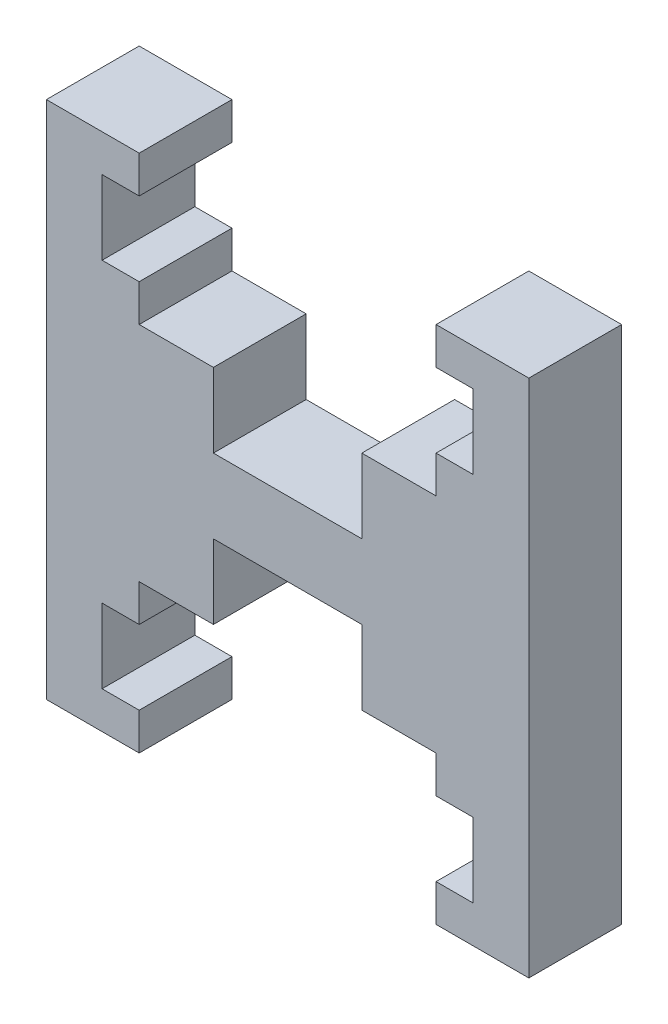
ISO-10303-21;
HEADER;
FILE_DESCRIPTION(('STEP AP214'),'2;1');
FILE_NAME('part.step','',(''),(''),'','','');
FILE_SCHEMA(('AUTOMOTIVE_DESIGN { 1 0 10303 214 1 1 1 1 }'));
ENDSEC;
DATA;
#1=APPLICATION_CONTEXT('core data for automotive mechanical design processes');
#2=APPLICATION_PROTOCOL_DEFINITION('international standard','automotive_design',2000,#1);
#3=PRODUCT_CONTEXT('',#1,'mechanical');
#4=PRODUCT('Part','Part','',(#3));
#5=PRODUCT_RELATED_PRODUCT_CATEGORY('part','',(#4));
#6=PRODUCT_DEFINITION_FORMATION('','',#4);
#7=PRODUCT_DEFINITION_CONTEXT('part definition',#1,'design');
#8=PRODUCT_DEFINITION('design','',#6,#7);
#9=PRODUCT_DEFINITION_SHAPE('','',#8);
#10=(LENGTH_UNIT() NAMED_UNIT(*) SI_UNIT(.MILLI.,.METRE.));
#11=(NAMED_UNIT(*) PLANE_ANGLE_UNIT() SI_UNIT($,.RADIAN.));
#12=(NAMED_UNIT(*) SI_UNIT($,.STERADIAN.) SOLID_ANGLE_UNIT());
#13=UNCERTAINTY_MEASURE_WITH_UNIT(LENGTH_MEASURE(1.E-05),#10,'distance_accuracy_value','');
#14=(GEOMETRIC_REPRESENTATION_CONTEXT(3) GLOBAL_UNCERTAINTY_ASSIGNED_CONTEXT((#13)) GLOBAL_UNIT_ASSIGNED_CONTEXT((#10,
#11,#12)) REPRESENTATION_CONTEXT('',''));
#15=CARTESIAN_POINT('',(0.,0.,0.));
#16=DIRECTION('',(0.,0.,1.));
#17=DIRECTION('',(1.,0.,0.));
#18=AXIS2_PLACEMENT_3D('',#15,#16,#17);
#19=CARTESIAN_POINT('',(101.6,50.7999999999999,63.5));
#20=DIRECTION('',(1.,0.,0.));
#21=DIRECTION('',(0.,1.,0.));
#22=AXIS2_PLACEMENT_3D('',#19,#20,#21);
#23=PLANE('',#22);
#24=DIRECTION('',(0.,-1.,0.));
#25=VECTOR('',#24,1.);
#26=CARTESIAN_POINT('',(101.6,50.7999999999999,-63.5));
#27=LINE('',#26,#25);
#28=CARTESIAN_POINT('',(101.6,152.4,-63.5));
#29=VERTEX_POINT('',#28);
#30=CARTESIAN_POINT('',(101.6,50.7999999999999,-63.5));
#31=VERTEX_POINT('',#30);
#32=EDGE_CURVE('E312',#29,#31,#27,.T.);
#33=ORIENTED_EDGE('',*,*,#32,.T.);
#34=DIRECTION('',(0.,0.,-1.));
#35=VECTOR('',#34,1.);
#36=CARTESIAN_POINT('',(101.6,50.7999999999999,63.5));
#37=LINE('',#36,#35);
#38=CARTESIAN_POINT('',(101.6,50.7999999999999,63.5));
#39=VERTEX_POINT('',#38);
#40=EDGE_CURVE('E11',#39,#31,#37,.T.);
#41=ORIENTED_EDGE('',*,*,#40,.F.);
#42=DIRECTION('',(0.,-1.,0.));
#43=VECTOR('',#42,1.);
#44=CARTESIAN_POINT('',(101.6,50.7999999999999,63.5));
#45=LINE('',#44,#43);
#46=CARTESIAN_POINT('',(101.6,152.4,63.5));
#47=VERTEX_POINT('',#46);
#48=EDGE_CURVE('E418',#47,#39,#45,.T.);
#49=ORIENTED_EDGE('',*,*,#48,.F.);
#50=DIRECTION('',(0.,0.,-1.));
#51=VECTOR('',#50,1.);
#52=CARTESIAN_POINT('',(101.6,152.4,63.5));
#53=LINE('',#52,#51);
#54=EDGE_CURVE('E308',#47,#29,#53,.T.);
#55=ORIENTED_EDGE('',*,*,#54,.T.);
#56=EDGE_LOOP('',(#33,#41,#49,#55));
#57=FACE_BOUND('',#56,.T.);
#58=ADVANCED_FACE('F43',(#57),#23,.F.);
#59=CARTESIAN_POINT('',(101.6,50.7999999999999,63.5));
#60=DIRECTION('',(0.,-1.,0.));
#61=DIRECTION('',(0.,0.,-1.));
#62=AXIS2_PLACEMENT_3D('',#59,#60,#61);
#63=PLANE('',#62);
#64=DIRECTION('',(-1.,0.,0.));
#65=VECTOR('',#64,1.);
#66=CARTESIAN_POINT('',(101.6,50.7999999999999,-63.5));
#67=LINE('',#66,#65);
#68=CARTESIAN_POINT('',(-101.6,50.7999999999999,-63.5));
#69=VERTEX_POINT('',#68);
#70=EDGE_CURVE('E316',#31,#69,#67,.T.);
#71=ORIENTED_EDGE('',*,*,#70,.T.);
#72=DIRECTION('',(0.,0.,-1.));
#73=VECTOR('',#72,1.);
#74=CARTESIAN_POINT('',(-101.6,50.7999999999999,63.5));
#75=LINE('',#74,#73);
#76=CARTESIAN_POINT('',(-101.6,50.7999999999999,63.5));
#77=VERTEX_POINT('',#76);
#78=EDGE_CURVE('E52',#77,#69,#75,.T.);
#79=ORIENTED_EDGE('',*,*,#78,.F.);
#80=DIRECTION('',(-1.,0.,0.));
#81=VECTOR('',#80,1.);
#82=CARTESIAN_POINT('',(101.6,50.7999999999999,63.5));
#83=LINE('',#82,#81);
#84=EDGE_CURVE('E187',#39,#77,#83,.T.);
#85=ORIENTED_EDGE('',*,*,#84,.F.);
#86=ORIENTED_EDGE('',*,*,#40,.T.);
#87=EDGE_LOOP('',(#71,#79,#85,#86));
#88=FACE_BOUND('',#87,.T.);
#89=ADVANCED_FACE('F680',(#88),#63,.F.);
#90=CARTESIAN_POINT('',(-101.6,50.7999999999999,63.5));
#91=DIRECTION('',(-1.,0.,0.));
#92=DIRECTION('',(0.,-1.,0.));
#93=AXIS2_PLACEMENT_3D('',#90,#91,#92);
#94=PLANE('',#93);
#95=DIRECTION('',(0.,1.,0.));
#96=VECTOR('',#95,1.);
#97=CARTESIAN_POINT('',(-101.6,50.7999999999999,-63.5));
#98=LINE('',#97,#96);
#99=CARTESIAN_POINT('',(-101.6,152.4,-63.5));
#100=VERTEX_POINT('',#99);
#101=EDGE_CURVE('E319',#69,#100,#98,.T.);
#102=ORIENTED_EDGE('',*,*,#101,.T.);
#103=DIRECTION('',(0.,0.,-1.));
#104=VECTOR('',#103,1.);
#105=CARTESIAN_POINT('',(-101.6,152.4,63.5));
#106=LINE('',#105,#104);
#107=CARTESIAN_POINT('',(-101.6,152.4,63.5));
#108=VERTEX_POINT('',#107);
#109=EDGE_CURVE('E541',#108,#100,#106,.T.);
#110=ORIENTED_EDGE('',*,*,#109,.F.);
#111=DIRECTION('',(0.,1.,0.));
#112=VECTOR('',#111,1.);
#113=CARTESIAN_POINT('',(-101.6,50.7999999999999,63.5));
#114=LINE('',#113,#112);
#115=EDGE_CURVE('E551',#77,#108,#114,.T.);
#116=ORIENTED_EDGE('',*,*,#115,.F.);
#117=ORIENTED_EDGE('',*,*,#78,.T.);
#118=EDGE_LOOP('',(#102,#110,#116,#117));
#119=FACE_BOUND('',#118,.T.);
#120=ADVANCED_FACE('F549',(#119),#94,.F.);
#121=CARTESIAN_POINT('',(-101.6,152.4,63.5));
#122=DIRECTION('',(0.,-1.,0.));
#123=DIRECTION('',(0.,0.,-1.));
#124=AXIS2_PLACEMENT_3D('',#121,#122,#123);
#125=PLANE('',#124);
#126=DIRECTION('',(-1.,0.,0.));
#127=VECTOR('',#126,1.);
#128=CARTESIAN_POINT('',(-101.6,152.4,-63.5));
#129=LINE('',#128,#127);
#130=CARTESIAN_POINT('',(-203.2,152.4,-63.5));
#131=VERTEX_POINT('',#130);
#132=EDGE_CURVE('E322',#100,#131,#129,.T.);
#133=ORIENTED_EDGE('',*,*,#132,.T.);
#134=DIRECTION('',(0.,0.,-1.));
#135=VECTOR('',#134,1.);
#136=CARTESIAN_POINT('',(-203.2,152.4,63.5));
#137=LINE('',#136,#135);
#138=CARTESIAN_POINT('',(-203.2,152.4,63.5));
#139=VERTEX_POINT('',#138);
#140=EDGE_CURVE('E537',#139,#131,#137,.T.);
#141=ORIENTED_EDGE('',*,*,#140,.F.);
#142=DIRECTION('',(-1.,0.,0.));
#143=VECTOR('',#142,1.);
#144=CARTESIAN_POINT('',(-101.6,152.4,63.5));
#145=LINE('',#144,#143);
#146=EDGE_CURVE('E570',#108,#139,#145,.T.);
#147=ORIENTED_EDGE('',*,*,#146,.F.);
#148=ORIENTED_EDGE('',*,*,#109,.T.);
#149=EDGE_LOOP('',(#133,#141,#147,#148));
#150=FACE_BOUND('',#149,.T.);
#151=ADVANCED_FACE('F560',(#150),#125,.F.);
#152=CARTESIAN_POINT('',(-203.2,152.4,63.5));
#153=DIRECTION('',(-1.,0.,0.));
#154=DIRECTION('',(0.,-1.,0.));
#155=AXIS2_PLACEMENT_3D('',#152,#153,#154);
#156=PLANE('',#155);
#157=DIRECTION('',(0.,1.,0.));
#158=VECTOR('',#157,1.);
#159=CARTESIAN_POINT('',(-203.2,152.4,-63.5));
#160=LINE('',#159,#158);
#161=CARTESIAN_POINT('',(-203.2,203.2,-63.5));
#162=VERTEX_POINT('',#161);
#163=EDGE_CURVE('E325',#131,#162,#160,.T.);
#164=ORIENTED_EDGE('',*,*,#163,.T.);
#165=DIRECTION('',(0.,0.,-1.));
#166=VECTOR('',#165,1.);
#167=CARTESIAN_POINT('',(-203.2,203.2,63.5));
#168=LINE('',#167,#166);
#169=CARTESIAN_POINT('',(-203.2,203.2,63.5));
#170=VERTEX_POINT('',#169);
#171=EDGE_CURVE('E533',#170,#162,#168,.T.);
#172=ORIENTED_EDGE('',*,*,#171,.F.);
#173=DIRECTION('',(0.,1.,0.));
#174=VECTOR('',#173,1.);
#175=CARTESIAN_POINT('',(-203.2,152.4,63.5));
#176=LINE('',#175,#174);
#177=EDGE_CURVE('E566',#139,#170,#176,.T.);
#178=ORIENTED_EDGE('',*,*,#177,.F.);
#179=ORIENTED_EDGE('',*,*,#140,.T.);
#180=EDGE_LOOP('',(#164,#172,#178,#179));
#181=FACE_BOUND('',#180,.T.);
#182=ADVANCED_FACE('F564',(#181),#156,.F.);
#183=CARTESIAN_POINT('',(-203.2,203.2,63.5));
#184=DIRECTION('',(0.,-1.,0.));
#185=DIRECTION('',(1.,0.,0.));
#186=AXIS2_PLACEMENT_3D('',#183,#184,#185);
#187=PLANE('',#186);
#188=DIRECTION('',(-1.,0.,0.));
#189=VECTOR('',#188,1.);
#190=CARTESIAN_POINT('',(-203.2,203.2,-63.5));
#191=LINE('',#190,#189);
#192=CARTESIAN_POINT('',(-254.,203.2,-63.5));
#193=VERTEX_POINT('',#192);
#194=EDGE_CURVE('E328',#162,#193,#191,.T.);
#195=ORIENTED_EDGE('',*,*,#194,.T.);
#196=DIRECTION('',(0.,0.,-1.));
#197=VECTOR('',#196,1.);
#198=CARTESIAN_POINT('',(-254.,203.2,63.5));
#199=LINE('',#198,#197);
#200=CARTESIAN_POINT('',(-254.,203.2,63.5));
#201=VERTEX_POINT('',#200);
#202=EDGE_CURVE('E529',#201,#193,#199,.T.);
#203=ORIENTED_EDGE('',*,*,#202,.F.);
#204=DIRECTION('',(-1.,0.,0.));
#205=VECTOR('',#204,1.);
#206=CARTESIAN_POINT('',(-203.2,203.2,63.5));
#207=LINE('',#206,#205);
#208=EDGE_CURVE('E569',#170,#201,#207,.T.);
#209=ORIENTED_EDGE('',*,*,#208,.F.);
#210=ORIENTED_EDGE('',*,*,#171,.T.);
#211=EDGE_LOOP('',(#195,#203,#209,#210));
#212=FACE_BOUND('',#211,.T.);
#213=ADVANCED_FACE('F693',(#212),#187,.F.);
#214=CARTESIAN_POINT('',(-254.,203.2,63.5));
#215=DIRECTION('',(-1.,0.,0.));
#216=DIRECTION('',(0.,-1.,0.));
#217=AXIS2_PLACEMENT_3D('',#214,#215,#216);
#218=PLANE('',#217);
#219=DIRECTION('',(0.,1.,0.));
#220=VECTOR('',#219,1.);
#221=CARTESIAN_POINT('',(-254.,203.2,-63.5));
#222=LINE('',#221,#220);
#223=CARTESIAN_POINT('',(-254.,304.8,-63.5));
#224=VERTEX_POINT('',#223);
#225=EDGE_CURVE('E331',#193,#224,#222,.T.);
#226=ORIENTED_EDGE('',*,*,#225,.T.);
#227=DIRECTION('',(0.,0.,-1.));
#228=VECTOR('',#227,1.);
#229=CARTESIAN_POINT('',(-254.,304.8,63.5));
#230=LINE('',#229,#228);
#231=CARTESIAN_POINT('',(-254.,304.8,63.5));
#232=VERTEX_POINT('',#231);
#233=EDGE_CURVE('E525',#232,#224,#230,.T.);
#234=ORIENTED_EDGE('',*,*,#233,.F.);
#235=DIRECTION('',(0.,1.,0.));
#236=VECTOR('',#235,1.);
#237=CARTESIAN_POINT('',(-254.,203.2,63.5));
#238=LINE('',#237,#236);
#239=EDGE_CURVE('E574',#201,#232,#238,.T.);
#240=ORIENTED_EDGE('',*,*,#239,.F.);
#241=ORIENTED_EDGE('',*,*,#202,.T.);
#242=EDGE_LOOP('',(#226,#234,#240,#241));
#243=FACE_BOUND('',#242,.T.);
#244=ADVANCED_FACE('F696',(#243),#218,.F.);
#245=CARTESIAN_POINT('',(-254.,304.8,63.5));
#246=DIRECTION('',(0.,1.,0.));
#247=DIRECTION('',(0.,0.,1.));
#248=AXIS2_PLACEMENT_3D('',#245,#246,#247);
#249=PLANE('',#248);
#250=DIRECTION('',(1.,0.,0.));
#251=VECTOR('',#250,1.);
#252=CARTESIAN_POINT('',(-254.,304.8,-63.5));
#253=LINE('',#252,#251);
#254=CARTESIAN_POINT('',(-203.2,304.8,-63.5));
#255=VERTEX_POINT('',#254);
#256=EDGE_CURVE('E334',#224,#255,#253,.T.);
#257=ORIENTED_EDGE('',*,*,#256,.T.);
#258=DIRECTION('',(0.,0.,-1.));
#259=VECTOR('',#258,1.);
#260=CARTESIAN_POINT('',(-203.2,304.8,63.5));
#261=LINE('',#260,#259);
#262=CARTESIAN_POINT('',(-203.2,304.8,63.5));
#263=VERTEX_POINT('',#262);
#264=EDGE_CURVE('E521',#263,#255,#261,.T.);
#265=ORIENTED_EDGE('',*,*,#264,.F.);
#266=DIRECTION('',(1.,0.,0.));
#267=VECTOR('',#266,1.);
#268=CARTESIAN_POINT('',(-254.,304.8,63.5));
#269=LINE('',#268,#267);
#270=EDGE_CURVE('E581',#232,#263,#269,.T.);
#271=ORIENTED_EDGE('',*,*,#270,.F.);
#272=ORIENTED_EDGE('',*,*,#233,.T.);
#273=EDGE_LOOP('',(#257,#265,#271,#272));
#274=FACE_BOUND('',#273,.T.);
#275=ADVANCED_FACE('F700',(#274),#249,.F.);
#276=CARTESIAN_POINT('',(-203.2,304.8,63.5));
#277=DIRECTION('',(-1.,0.,0.));
#278=DIRECTION('',(0.,-1.,0.));
#279=AXIS2_PLACEMENT_3D('',#276,#277,#278);
#280=PLANE('',#279);
#281=DIRECTION('',(0.,1.,0.));
#282=VECTOR('',#281,1.);
#283=CARTESIAN_POINT('',(-203.2,304.8,-63.5));
#284=LINE('',#283,#282);
#285=CARTESIAN_POINT('',(-203.2,355.6,-63.5));
#286=VERTEX_POINT('',#285);
#287=EDGE_CURVE('E337',#255,#286,#284,.T.);
#288=ORIENTED_EDGE('',*,*,#287,.T.);
#289=DIRECTION('',(0.,0.,-1.));
#290=VECTOR('',#289,1.);
#291=CARTESIAN_POINT('',(-203.2,355.6,63.5));
#292=LINE('',#291,#290);
#293=CARTESIAN_POINT('',(-203.2,355.6,63.5));
#294=VERTEX_POINT('',#293);
#295=EDGE_CURVE('E517',#294,#286,#292,.T.);
#296=ORIENTED_EDGE('',*,*,#295,.F.);
#297=DIRECTION('',(0.,1.,0.));
#298=VECTOR('',#297,1.);
#299=CARTESIAN_POINT('',(-203.2,304.8,63.5));
#300=LINE('',#299,#298);
#301=EDGE_CURVE('E584',#263,#294,#300,.T.);
#302=ORIENTED_EDGE('',*,*,#301,.F.);
#303=ORIENTED_EDGE('',*,*,#264,.T.);
#304=EDGE_LOOP('',(#288,#296,#302,#303));
#305=FACE_BOUND('',#304,.T.);
#306=ADVANCED_FACE('F704',(#305),#280,.F.);
#307=CARTESIAN_POINT('',(-203.2,355.6,63.5));
#308=DIRECTION('',(0.,-1.,0.));
#309=DIRECTION('',(0.,0.,-1.));
#310=AXIS2_PLACEMENT_3D('',#307,#308,#309);
#311=PLANE('',#310);
#312=DIRECTION('',(-1.,0.,0.));
#313=VECTOR('',#312,1.);
#314=CARTESIAN_POINT('',(-203.2,355.6,-63.5));
#315=LINE('',#314,#313);
#316=CARTESIAN_POINT('',(-330.2,355.6,-63.5));
#317=VERTEX_POINT('',#316);
#318=EDGE_CURVE('E340',#286,#317,#315,.T.);
#319=ORIENTED_EDGE('',*,*,#318,.T.);
#320=DIRECTION('',(0.,0.,-1.));
#321=VECTOR('',#320,1.);
#322=CARTESIAN_POINT('',(-330.2,355.6,63.5));
#323=LINE('',#322,#321);
#324=CARTESIAN_POINT('',(-330.2,355.6,63.5));
#325=VERTEX_POINT('',#324);
#326=EDGE_CURVE('E513',#325,#317,#323,.T.);
#327=ORIENTED_EDGE('',*,*,#326,.F.);
#328=DIRECTION('',(-1.,0.,0.));
#329=VECTOR('',#328,1.);
#330=CARTESIAN_POINT('',(-203.2,355.6,63.5));
#331=LINE('',#330,#329);
#332=EDGE_CURVE('E587',#294,#325,#331,.T.);
#333=ORIENTED_EDGE('',*,*,#332,.F.);
#334=ORIENTED_EDGE('',*,*,#295,.T.);
#335=EDGE_LOOP('',(#319,#327,#333,#334));
#336=FACE_BOUND('',#335,.T.);
#337=ADVANCED_FACE('F708',(#336),#311,.F.);
#338=CARTESIAN_POINT('',(-330.2,-355.6,63.5));
#339=DIRECTION('',(1.,0.,0.));
#340=DIRECTION('',(0.,0.,-1.));
#341=AXIS2_PLACEMENT_3D('',#338,#339,#340);
#342=PLANE('',#341);
#343=DIRECTION('',(0.,-1.,0.));
#344=VECTOR('',#343,1.);
#345=CARTESIAN_POINT('',(-330.2,-355.6,-63.5));
#346=LINE('',#345,#344);
#347=CARTESIAN_POINT('',(-330.2,-355.6,-63.5));
#348=VERTEX_POINT('',#347);
#349=EDGE_CURVE('E343',#317,#348,#346,.T.);
#350=ORIENTED_EDGE('',*,*,#349,.T.);
#351=DIRECTION('',(0.,0.,-1.));
#352=VECTOR('',#351,1.);
#353=CARTESIAN_POINT('',(-330.2,-355.6,63.5));
#354=LINE('',#353,#352);
#355=CARTESIAN_POINT('',(-330.2,-355.6,63.5));
#356=VERTEX_POINT('',#355);
#357=EDGE_CURVE('E509',#356,#348,#354,.T.);
#358=ORIENTED_EDGE('',*,*,#357,.F.);
#359=DIRECTION('',(0.,-1.,0.));
#360=VECTOR('',#359,1.);
#361=CARTESIAN_POINT('',(-330.2,-355.6,63.5));
#362=LINE('',#361,#360);
#363=EDGE_CURVE('E590',#325,#356,#362,.T.);
#364=ORIENTED_EDGE('',*,*,#363,.F.);
#365=ORIENTED_EDGE('',*,*,#326,.T.);
#366=EDGE_LOOP('',(#350,#358,#364,#365));
#367=FACE_BOUND('',#366,.T.);
#368=ADVANCED_FACE('F712',(#367),#342,.F.);
#369=CARTESIAN_POINT('',(-203.2,-355.6,63.5));
#370=DIRECTION('',(0.,1.,0.));
#371=DIRECTION('',(0.,0.,1.));
#372=AXIS2_PLACEMENT_3D('',#369,#370,#371);
#373=PLANE('',#372);
#374=DIRECTION('',(1.,0.,0.));
#375=VECTOR('',#374,1.);
#376=CARTESIAN_POINT('',(-203.2,-355.6,-63.5));
#377=LINE('',#376,#375);
#378=CARTESIAN_POINT('',(-203.2,-355.6,-63.5));
#379=VERTEX_POINT('',#378);
#380=EDGE_CURVE('E346',#348,#379,#377,.T.);
#381=ORIENTED_EDGE('',*,*,#380,.T.);
#382=DIRECTION('',(0.,0.,-1.));
#383=VECTOR('',#382,1.);
#384=CARTESIAN_POINT('',(-203.2,-355.6,63.5));
#385=LINE('',#384,#383);
#386=CARTESIAN_POINT('',(-203.2,-355.6,63.5));
#387=VERTEX_POINT('',#386);
#388=EDGE_CURVE('E505',#387,#379,#385,.T.);
#389=ORIENTED_EDGE('',*,*,#388,.F.);
#390=DIRECTION('',(1.,0.,0.));
#391=VECTOR('',#390,1.);
#392=CARTESIAN_POINT('',(-203.2,-355.6,63.5));
#393=LINE('',#392,#391);
#394=EDGE_CURVE('E593',#356,#387,#393,.T.);
#395=ORIENTED_EDGE('',*,*,#394,.F.);
#396=ORIENTED_EDGE('',*,*,#357,.T.);
#397=EDGE_LOOP('',(#381,#389,#395,#396));
#398=FACE_BOUND('',#397,.T.);
#399=ADVANCED_FACE('F716',(#398),#373,.F.);
#400=CARTESIAN_POINT('',(-203.2,-304.8,63.5));
#401=DIRECTION('',(-1.,0.,0.));
#402=DIRECTION('',(0.,-1.,0.));
#403=AXIS2_PLACEMENT_3D('',#400,#401,#402);
#404=PLANE('',#403);
#405=DIRECTION('',(0.,1.,0.));
#406=VECTOR('',#405,1.);
#407=CARTESIAN_POINT('',(-203.2,-304.8,-63.5));
#408=LINE('',#407,#406);
#409=CARTESIAN_POINT('',(-203.2,-304.8,-63.5));
#410=VERTEX_POINT('',#409);
#411=EDGE_CURVE('E349',#379,#410,#408,.T.);
#412=ORIENTED_EDGE('',*,*,#411,.T.);
#413=DIRECTION('',(0.,0.,-1.));
#414=VECTOR('',#413,1.);
#415=CARTESIAN_POINT('',(-203.2,-304.8,63.5));
#416=LINE('',#415,#414);
#417=CARTESIAN_POINT('',(-203.2,-304.8,63.5));
#418=VERTEX_POINT('',#417);
#419=EDGE_CURVE('E501',#418,#410,#416,.T.);
#420=ORIENTED_EDGE('',*,*,#419,.F.);
#421=DIRECTION('',(0.,1.,0.));
#422=VECTOR('',#421,1.);
#423=CARTESIAN_POINT('',(-203.2,-304.8,63.5));
#424=LINE('',#423,#422);
#425=EDGE_CURVE('E596',#387,#418,#424,.T.);
#426=ORIENTED_EDGE('',*,*,#425,.F.);
#427=ORIENTED_EDGE('',*,*,#388,.T.);
#428=EDGE_LOOP('',(#412,#420,#426,#427));
#429=FACE_BOUND('',#428,.T.);
#430=ADVANCED_FACE('F720',(#429),#404,.F.);
#431=CARTESIAN_POINT('',(-254.,-304.8,63.5));
#432=DIRECTION('',(0.,-1.,0.));
#433=DIRECTION('',(0.,0.,-1.));
#434=AXIS2_PLACEMENT_3D('',#431,#432,#433);
#435=PLANE('',#434);
#436=DIRECTION('',(-1.,0.,0.));
#437=VECTOR('',#436,1.);
#438=CARTESIAN_POINT('',(-254.,-304.8,-63.5));
#439=LINE('',#438,#437);
#440=CARTESIAN_POINT('',(-254.,-304.8,-63.5));
#441=VERTEX_POINT('',#440);
#442=EDGE_CURVE('E352',#410,#441,#439,.T.);
#443=ORIENTED_EDGE('',*,*,#442,.T.);
#444=DIRECTION('',(0.,0.,-1.));
#445=VECTOR('',#444,1.);
#446=CARTESIAN_POINT('',(-254.,-304.8,63.5));
#447=LINE('',#446,#445);
#448=CARTESIAN_POINT('',(-254.,-304.8,63.5));
#449=VERTEX_POINT('',#448);
#450=EDGE_CURVE('E497',#449,#441,#447,.T.);
#451=ORIENTED_EDGE('',*,*,#450,.F.);
#452=DIRECTION('',(-1.,0.,0.));
#453=VECTOR('',#452,1.);
#454=CARTESIAN_POINT('',(-254.,-304.8,63.5));
#455=LINE('',#454,#453);
#456=EDGE_CURVE('E599',#418,#449,#455,.T.);
#457=ORIENTED_EDGE('',*,*,#456,.F.);
#458=ORIENTED_EDGE('',*,*,#419,.T.);
#459=EDGE_LOOP('',(#443,#451,#457,#458));
#460=FACE_BOUND('',#459,.T.);
#461=ADVANCED_FACE('F724',(#460),#435,.F.);
#462=CARTESIAN_POINT('',(-254.,-203.2,63.5));
#463=DIRECTION('',(-1.,0.,0.));
#464=DIRECTION('',(0.,-1.,0.));
#465=AXIS2_PLACEMENT_3D('',#462,#463,#464);
#466=PLANE('',#465);
#467=DIRECTION('',(0.,1.,0.));
#468=VECTOR('',#467,1.);
#469=CARTESIAN_POINT('',(-254.,-203.2,-63.5));
#470=LINE('',#469,#468);
#471=CARTESIAN_POINT('',(-254.,-203.2,-63.5));
#472=VERTEX_POINT('',#471);
#473=EDGE_CURVE('E355',#441,#472,#470,.T.);
#474=ORIENTED_EDGE('',*,*,#473,.T.);
#475=DIRECTION('',(0.,0.,-1.));
#476=VECTOR('',#475,1.);
#477=CARTESIAN_POINT('',(-254.,-203.2,63.5));
#478=LINE('',#477,#476);
#479=CARTESIAN_POINT('',(-254.,-203.2,63.5));
#480=VERTEX_POINT('',#479);
#481=EDGE_CURVE('E493',#480,#472,#478,.T.);
#482=ORIENTED_EDGE('',*,*,#481,.F.);
#483=DIRECTION('',(0.,1.,0.));
#484=VECTOR('',#483,1.);
#485=CARTESIAN_POINT('',(-254.,-203.2,63.5));
#486=LINE('',#485,#484);
#487=EDGE_CURVE('E602',#449,#480,#486,.T.);
#488=ORIENTED_EDGE('',*,*,#487,.F.);
#489=ORIENTED_EDGE('',*,*,#450,.T.);
#490=EDGE_LOOP('',(#474,#482,#488,#489));
#491=FACE_BOUND('',#490,.T.);
#492=ADVANCED_FACE('F728',(#491),#466,.F.);
#493=CARTESIAN_POINT('',(-203.2,-203.2,63.5));
#494=DIRECTION('',(0.,1.,0.));
#495=DIRECTION('',(-1.,0.,0.));
#496=AXIS2_PLACEMENT_3D('',#493,#494,#495);
#497=PLANE('',#496);
#498=DIRECTION('',(1.,0.,0.));
#499=VECTOR('',#498,1.);
#500=CARTESIAN_POINT('',(-203.2,-203.2,-63.5));
#501=LINE('',#500,#499);
#502=CARTESIAN_POINT('',(-203.2,-203.2,-63.5));
#503=VERTEX_POINT('',#502);
#504=EDGE_CURVE('E358',#472,#503,#501,.T.);
#505=ORIENTED_EDGE('',*,*,#504,.T.);
#506=DIRECTION('',(0.,0.,-1.));
#507=VECTOR('',#506,1.);
#508=CARTESIAN_POINT('',(-203.2,-203.2,63.5));
#509=LINE('',#508,#507);
#510=CARTESIAN_POINT('',(-203.2,-203.2,63.5));
#511=VERTEX_POINT('',#510);
#512=EDGE_CURVE('E489',#511,#503,#509,.T.);
#513=ORIENTED_EDGE('',*,*,#512,.F.);
#514=DIRECTION('',(1.,0.,0.));
#515=VECTOR('',#514,1.);
#516=CARTESIAN_POINT('',(-203.2,-203.2,63.5));
#517=LINE('',#516,#515);
#518=EDGE_CURVE('E605',#480,#511,#517,.T.);
#519=ORIENTED_EDGE('',*,*,#518,.F.);
#520=ORIENTED_EDGE('',*,*,#481,.T.);
#521=EDGE_LOOP('',(#505,#513,#519,#520));
#522=FACE_BOUND('',#521,.T.);
#523=ADVANCED_FACE('F732',(#522),#497,.F.);
#524=CARTESIAN_POINT('',(-203.2,-152.4,63.5));
#525=DIRECTION('',(-1.,0.,0.));
#526=DIRECTION('',(0.,-1.,0.));
#527=AXIS2_PLACEMENT_3D('',#524,#525,#526);
#528=PLANE('',#527);
#529=DIRECTION('',(0.,1.,0.));
#530=VECTOR('',#529,1.);
#531=CARTESIAN_POINT('',(-203.2,-152.4,-63.5));
#532=LINE('',#531,#530);
#533=CARTESIAN_POINT('',(-203.2,-152.4,-63.5));
#534=VERTEX_POINT('',#533);
#535=EDGE_CURVE('E361',#503,#534,#532,.T.);
#536=ORIENTED_EDGE('',*,*,#535,.T.);
#537=DIRECTION('',(0.,0.,-1.));
#538=VECTOR('',#537,1.);
#539=CARTESIAN_POINT('',(-203.2,-152.4,63.5));
#540=LINE('',#539,#538);
#541=CARTESIAN_POINT('',(-203.2,-152.4,63.5));
#542=VERTEX_POINT('',#541);
#543=EDGE_CURVE('E485',#542,#534,#540,.T.);
#544=ORIENTED_EDGE('',*,*,#543,.F.);
#545=DIRECTION('',(0.,1.,0.));
#546=VECTOR('',#545,1.);
#547=CARTESIAN_POINT('',(-203.2,-152.4,63.5));
#548=LINE('',#547,#546);
#549=EDGE_CURVE('E608',#511,#542,#548,.T.);
#550=ORIENTED_EDGE('',*,*,#549,.F.);
#551=ORIENTED_EDGE('',*,*,#512,.T.);
#552=EDGE_LOOP('',(#536,#544,#550,#551));
#553=FACE_BOUND('',#552,.T.);
#554=ADVANCED_FACE('F736',(#553),#528,.F.);
#555=CARTESIAN_POINT('',(-101.6,-152.4,63.5));
#556=DIRECTION('',(0.,1.,0.));
#557=DIRECTION('',(0.,0.,1.));
#558=AXIS2_PLACEMENT_3D('',#555,#556,#557);
#559=PLANE('',#558);
#560=DIRECTION('',(1.,0.,0.));
#561=VECTOR('',#560,1.);
#562=CARTESIAN_POINT('',(-101.6,-152.4,-63.5));
#563=LINE('',#562,#561);
#564=CARTESIAN_POINT('',(-101.6,-152.4,-63.5));
#565=VERTEX_POINT('',#564);
#566=EDGE_CURVE('E364',#534,#565,#563,.T.);
#567=ORIENTED_EDGE('',*,*,#566,.T.);
#568=DIRECTION('',(0.,0.,-1.));
#569=VECTOR('',#568,1.);
#570=CARTESIAN_POINT('',(-101.6,-152.4,63.5));
#571=LINE('',#570,#569);
#572=CARTESIAN_POINT('',(-101.6,-152.4,63.5));
#573=VERTEX_POINT('',#572);
#574=EDGE_CURVE('E481',#573,#565,#571,.T.);
#575=ORIENTED_EDGE('',*,*,#574,.F.);
#576=DIRECTION('',(1.,0.,0.));
#577=VECTOR('',#576,1.);
#578=CARTESIAN_POINT('',(-101.6,-152.4,63.5));
#579=LINE('',#578,#577);
#580=EDGE_CURVE('E611',#542,#573,#579,.T.);
#581=ORIENTED_EDGE('',*,*,#580,.F.);
#582=ORIENTED_EDGE('',*,*,#543,.T.);
#583=EDGE_LOOP('',(#567,#575,#581,#582));
#584=FACE_BOUND('',#583,.T.);
#585=ADVANCED_FACE('F740',(#584),#559,.F.);
#586=CARTESIAN_POINT('',(-101.6,-50.7999999999999,63.5));
#587=DIRECTION('',(-1.,0.,0.));
#588=DIRECTION('',(0.,-1.,0.));
#589=AXIS2_PLACEMENT_3D('',#586,#587,#588);
#590=PLANE('',#589);
#591=DIRECTION('',(0.,1.,0.));
#592=VECTOR('',#591,1.);
#593=CARTESIAN_POINT('',(-101.6,-50.7999999999999,-63.5));
#594=LINE('',#593,#592);
#595=CARTESIAN_POINT('',(-101.6,-50.7999999999999,-63.5));
#596=VERTEX_POINT('',#595);
#597=EDGE_CURVE('E367',#565,#596,#594,.T.);
#598=ORIENTED_EDGE('',*,*,#597,.T.);
#599=DIRECTION('',(0.,0.,-1.));
#600=VECTOR('',#599,1.);
#601=CARTESIAN_POINT('',(-101.6,-50.7999999999999,63.5));
#602=LINE('',#601,#600);
#603=CARTESIAN_POINT('',(-101.6,-50.7999999999999,63.5));
#604=VERTEX_POINT('',#603);
#605=EDGE_CURVE('E477',#604,#596,#602,.T.);
#606=ORIENTED_EDGE('',*,*,#605,.F.);
#607=DIRECTION('',(0.,1.,0.));
#608=VECTOR('',#607,1.);
#609=CARTESIAN_POINT('',(-101.6,-50.7999999999999,63.5));
#610=LINE('',#609,#608);
#611=EDGE_CURVE('E614',#573,#604,#610,.T.);
#612=ORIENTED_EDGE('',*,*,#611,.F.);
#613=ORIENTED_EDGE('',*,*,#574,.T.);
#614=EDGE_LOOP('',(#598,#606,#612,#613));
#615=FACE_BOUND('',#614,.T.);
#616=ADVANCED_FACE('F744',(#615),#590,.F.);
#617=CARTESIAN_POINT('',(101.6,-50.7999999999999,63.5));
#618=DIRECTION('',(0.,1.,0.));
#619=DIRECTION('',(0.,0.,1.));
#620=AXIS2_PLACEMENT_3D('',#617,#618,#619);
#621=PLANE('',#620);
#622=DIRECTION('',(1.,0.,0.));
#623=VECTOR('',#622,1.);
#624=CARTESIAN_POINT('',(101.6,-50.7999999999999,-63.5));
#625=LINE('',#624,#623);
#626=CARTESIAN_POINT('',(101.6,-50.7999999999999,-63.5));
#627=VERTEX_POINT('',#626);
#628=EDGE_CURVE('E370',#596,#627,#625,.T.);
#629=ORIENTED_EDGE('',*,*,#628,.T.);
#630=DIRECTION('',(0.,0.,-1.));
#631=VECTOR('',#630,1.);
#632=CARTESIAN_POINT('',(101.6,-50.7999999999999,63.5));
#633=LINE('',#632,#631);
#634=CARTESIAN_POINT('',(101.6,-50.7999999999999,63.5));
#635=VERTEX_POINT('',#634);
#636=EDGE_CURVE('E473',#635,#627,#633,.T.);
#637=ORIENTED_EDGE('',*,*,#636,.F.);
#638=DIRECTION('',(1.,0.,0.));
#639=VECTOR('',#638,1.);
#640=CARTESIAN_POINT('',(101.6,-50.7999999999999,63.5));
#641=LINE('',#640,#639);
#642=EDGE_CURVE('E617',#604,#635,#641,.T.);
#643=ORIENTED_EDGE('',*,*,#642,.F.);
#644=ORIENTED_EDGE('',*,*,#605,.T.);
#645=EDGE_LOOP('',(#629,#637,#643,#644));
#646=FACE_BOUND('',#645,.T.);
#647=ADVANCED_FACE('F748',(#646),#621,.F.);
#648=CARTESIAN_POINT('',(101.6,-50.7999999999999,63.5));
#649=DIRECTION('',(1.,0.,0.));
#650=DIRECTION('',(0.,1.,0.));
#651=AXIS2_PLACEMENT_3D('',#648,#649,#650);
#652=PLANE('',#651);
#653=DIRECTION('',(0.,-1.,0.));
#654=VECTOR('',#653,1.);
#655=CARTESIAN_POINT('',(101.6,-50.7999999999999,-63.5));
#656=LINE('',#655,#654);
#657=CARTESIAN_POINT('',(101.6,-152.4,-63.5));
#658=VERTEX_POINT('',#657);
#659=EDGE_CURVE('E373',#627,#658,#656,.T.);
#660=ORIENTED_EDGE('',*,*,#659,.T.);
#661=DIRECTION('',(0.,0.,-1.));
#662=VECTOR('',#661,1.);
#663=CARTESIAN_POINT('',(101.6,-152.4,63.5));
#664=LINE('',#663,#662);
#665=CARTESIAN_POINT('',(101.6,-152.4,63.5));
#666=VERTEX_POINT('',#665);
#667=EDGE_CURVE('E469',#666,#658,#664,.T.);
#668=ORIENTED_EDGE('',*,*,#667,.F.);
#669=DIRECTION('',(0.,-1.,0.));
#670=VECTOR('',#669,1.);
#671=CARTESIAN_POINT('',(101.6,-50.7999999999999,63.5));
#672=LINE('',#671,#670);
#673=EDGE_CURVE('E620',#635,#666,#672,.T.);
#674=ORIENTED_EDGE('',*,*,#673,.F.);
#675=ORIENTED_EDGE('',*,*,#636,.T.);
#676=EDGE_LOOP('',(#660,#668,#674,#675));
#677=FACE_BOUND('',#676,.T.);
#678=ADVANCED_FACE('F752',(#677),#652,.F.);
#679=CARTESIAN_POINT('',(101.6,-152.4,63.5));
#680=DIRECTION('',(0.,1.,0.));
#681=DIRECTION('',(0.,0.,1.));
#682=AXIS2_PLACEMENT_3D('',#679,#680,#681);
#683=PLANE('',#682);
#684=DIRECTION('',(1.,0.,0.));
#685=VECTOR('',#684,1.);
#686=CARTESIAN_POINT('',(101.6,-152.4,-63.5));
#687=LINE('',#686,#685);
#688=CARTESIAN_POINT('',(203.2,-152.4,-63.5));
#689=VERTEX_POINT('',#688);
#690=EDGE_CURVE('E376',#658,#689,#687,.T.);
#691=ORIENTED_EDGE('',*,*,#690,.T.);
#692=DIRECTION('',(0.,0.,-1.));
#693=VECTOR('',#692,1.);
#694=CARTESIAN_POINT('',(203.2,-152.4,63.5));
#695=LINE('',#694,#693);
#696=CARTESIAN_POINT('',(203.2,-152.4,63.5));
#697=VERTEX_POINT('',#696);
#698=EDGE_CURVE('E465',#697,#689,#695,.T.);
#699=ORIENTED_EDGE('',*,*,#698,.F.);
#700=DIRECTION('',(1.,0.,0.));
#701=VECTOR('',#700,1.);
#702=CARTESIAN_POINT('',(101.6,-152.4,63.5));
#703=LINE('',#702,#701);
#704=EDGE_CURVE('E623',#666,#697,#703,.T.);
#705=ORIENTED_EDGE('',*,*,#704,.F.);
#706=ORIENTED_EDGE('',*,*,#667,.T.);
#707=EDGE_LOOP('',(#691,#699,#705,#706));
#708=FACE_BOUND('',#707,.T.);
#709=ADVANCED_FACE('F756',(#708),#683,.F.);
#710=CARTESIAN_POINT('',(203.2,-152.4,63.5));
#711=DIRECTION('',(1.,0.,0.));
#712=DIRECTION('',(0.,1.,0.));
#713=AXIS2_PLACEMENT_3D('',#710,#711,#712);
#714=PLANE('',#713);
#715=DIRECTION('',(0.,-1.,0.));
#716=VECTOR('',#715,1.);
#717=CARTESIAN_POINT('',(203.2,-152.4,-63.5));
#718=LINE('',#717,#716);
#719=CARTESIAN_POINT('',(203.2,-203.2,-63.5));
#720=VERTEX_POINT('',#719);
#721=EDGE_CURVE('E379',#689,#720,#718,.T.);
#722=ORIENTED_EDGE('',*,*,#721,.T.);
#723=DIRECTION('',(0.,0.,-1.));
#724=VECTOR('',#723,1.);
#725=CARTESIAN_POINT('',(203.2,-203.2,63.5));
#726=LINE('',#725,#724);
#727=CARTESIAN_POINT('',(203.2,-203.2,63.5));
#728=VERTEX_POINT('',#727);
#729=EDGE_CURVE('E461',#728,#720,#726,.T.);
#730=ORIENTED_EDGE('',*,*,#729,.F.);
#731=DIRECTION('',(0.,-1.,0.));
#732=VECTOR('',#731,1.);
#733=CARTESIAN_POINT('',(203.2,-152.4,63.5));
#734=LINE('',#733,#732);
#735=EDGE_CURVE('E626',#697,#728,#734,.T.);
#736=ORIENTED_EDGE('',*,*,#735,.F.);
#737=ORIENTED_EDGE('',*,*,#698,.T.);
#738=EDGE_LOOP('',(#722,#730,#736,#737));
#739=FACE_BOUND('',#738,.T.);
#740=ADVANCED_FACE('F760',(#739),#714,.F.);
#741=CARTESIAN_POINT('',(203.2,-203.2,63.5));
#742=DIRECTION('',(0.,1.,0.));
#743=DIRECTION('',(-1.,0.,0.));
#744=AXIS2_PLACEMENT_3D('',#741,#742,#743);
#745=PLANE('',#744);
#746=DIRECTION('',(1.,0.,0.));
#747=VECTOR('',#746,1.);
#748=CARTESIAN_POINT('',(203.2,-203.2,-63.5));
#749=LINE('',#748,#747);
#750=CARTESIAN_POINT('',(254.,-203.2,-63.5));
#751=VERTEX_POINT('',#750);
#752=EDGE_CURVE('E382',#720,#751,#749,.T.);
#753=ORIENTED_EDGE('',*,*,#752,.T.);
#754=DIRECTION('',(0.,0.,-1.));
#755=VECTOR('',#754,1.);
#756=CARTESIAN_POINT('',(254.,-203.2,63.5));
#757=LINE('',#756,#755);
#758=CARTESIAN_POINT('',(254.,-203.2,63.5));
#759=VERTEX_POINT('',#758);
#760=EDGE_CURVE('E457',#759,#751,#757,.T.);
#761=ORIENTED_EDGE('',*,*,#760,.F.);
#762=DIRECTION('',(1.,0.,0.));
#763=VECTOR('',#762,1.);
#764=CARTESIAN_POINT('',(203.2,-203.2,63.5));
#765=LINE('',#764,#763);
#766=EDGE_CURVE('E629',#728,#759,#765,.T.);
#767=ORIENTED_EDGE('',*,*,#766,.F.);
#768=ORIENTED_EDGE('',*,*,#729,.T.);
#769=EDGE_LOOP('',(#753,#761,#767,#768));
#770=FACE_BOUND('',#769,.T.);
#771=ADVANCED_FACE('F764',(#770),#745,.F.);
#772=CARTESIAN_POINT('',(254.,-203.2,63.5));
#773=DIRECTION('',(1.,0.,0.));
#774=DIRECTION('',(0.,1.,0.));
#775=AXIS2_PLACEMENT_3D('',#772,#773,#774);
#776=PLANE('',#775);
#777=DIRECTION('',(0.,-1.,0.));
#778=VECTOR('',#777,1.);
#779=CARTESIAN_POINT('',(254.,-203.2,-63.5));
#780=LINE('',#779,#778);
#781=CARTESIAN_POINT('',(254.,-304.8,-63.5));
#782=VERTEX_POINT('',#781);
#783=EDGE_CURVE('E385',#751,#782,#780,.T.);
#784=ORIENTED_EDGE('',*,*,#783,.T.);
#785=DIRECTION('',(0.,0.,-1.));
#786=VECTOR('',#785,1.);
#787=CARTESIAN_POINT('',(254.,-304.8,63.5));
#788=LINE('',#787,#786);
#789=CARTESIAN_POINT('',(254.,-304.8,63.5));
#790=VERTEX_POINT('',#789);
#791=EDGE_CURVE('E453',#790,#782,#788,.T.);
#792=ORIENTED_EDGE('',*,*,#791,.F.);
#793=DIRECTION('',(0.,-1.,0.));
#794=VECTOR('',#793,1.);
#795=CARTESIAN_POINT('',(254.,-203.2,63.5));
#796=LINE('',#795,#794);
#797=EDGE_CURVE('E632',#759,#790,#796,.T.);
#798=ORIENTED_EDGE('',*,*,#797,.F.);
#799=ORIENTED_EDGE('',*,*,#760,.T.);
#800=EDGE_LOOP('',(#784,#792,#798,#799));
#801=FACE_BOUND('',#800,.T.);
#802=ADVANCED_FACE('F768',(#801),#776,.F.);
#803=CARTESIAN_POINT('',(254.,-304.8,63.5));
#804=DIRECTION('',(0.,-1.,0.));
#805=DIRECTION('',(0.,0.,-1.));
#806=AXIS2_PLACEMENT_3D('',#803,#804,#805);
#807=PLANE('',#806);
#808=DIRECTION('',(-1.,0.,0.));
#809=VECTOR('',#808,1.);
#810=CARTESIAN_POINT('',(254.,-304.8,-63.5));
#811=LINE('',#810,#809);
#812=CARTESIAN_POINT('',(203.2,-304.8,-63.5));
#813=VERTEX_POINT('',#812);
#814=EDGE_CURVE('E388',#782,#813,#811,.T.);
#815=ORIENTED_EDGE('',*,*,#814,.T.);
#816=DIRECTION('',(0.,0.,-1.));
#817=VECTOR('',#816,1.);
#818=CARTESIAN_POINT('',(203.2,-304.8,63.5));
#819=LINE('',#818,#817);
#820=CARTESIAN_POINT('',(203.2,-304.8,63.5));
#821=VERTEX_POINT('',#820);
#822=EDGE_CURVE('E449',#821,#813,#819,.T.);
#823=ORIENTED_EDGE('',*,*,#822,.F.);
#824=DIRECTION('',(-1.,0.,0.));
#825=VECTOR('',#824,1.);
#826=CARTESIAN_POINT('',(254.,-304.8,63.5));
#827=LINE('',#826,#825);
#828=EDGE_CURVE('E635',#790,#821,#827,.T.);
#829=ORIENTED_EDGE('',*,*,#828,.F.);
#830=ORIENTED_EDGE('',*,*,#791,.T.);
#831=EDGE_LOOP('',(#815,#823,#829,#830));
#832=FACE_BOUND('',#831,.T.);
#833=ADVANCED_FACE('F772',(#832),#807,.F.);
#834=CARTESIAN_POINT('',(203.2,-304.8,63.5));
#835=DIRECTION('',(1.,0.,0.));
#836=DIRECTION('',(0.,1.,0.));
#837=AXIS2_PLACEMENT_3D('',#834,#835,#836);
#838=PLANE('',#837);
#839=DIRECTION('',(0.,-1.,0.));
#840=VECTOR('',#839,1.);
#841=CARTESIAN_POINT('',(203.2,-304.8,-63.5));
#842=LINE('',#841,#840);
#843=CARTESIAN_POINT('',(203.2,-355.6,-63.5));
#844=VERTEX_POINT('',#843);
#845=EDGE_CURVE('E391',#813,#844,#842,.T.);
#846=ORIENTED_EDGE('',*,*,#845,.T.);
#847=DIRECTION('',(0.,0.,-1.));
#848=VECTOR('',#847,1.);
#849=CARTESIAN_POINT('',(203.2,-355.6,63.5));
#850=LINE('',#849,#848);
#851=CARTESIAN_POINT('',(203.2,-355.6,63.5));
#852=VERTEX_POINT('',#851);
#853=EDGE_CURVE('E445',#852,#844,#850,.T.);
#854=ORIENTED_EDGE('',*,*,#853,.F.);
#855=DIRECTION('',(0.,-1.,0.));
#856=VECTOR('',#855,1.);
#857=CARTESIAN_POINT('',(203.2,-304.8,63.5));
#858=LINE('',#857,#856);
#859=EDGE_CURVE('E638',#821,#852,#858,.T.);
#860=ORIENTED_EDGE('',*,*,#859,.F.);
#861=ORIENTED_EDGE('',*,*,#822,.T.);
#862=EDGE_LOOP('',(#846,#854,#860,#861));
#863=FACE_BOUND('',#862,.T.);
#864=ADVANCED_FACE('F776',(#863),#838,.F.);
#865=CARTESIAN_POINT('',(203.2,-355.6,63.5));
#866=DIRECTION('',(0.,1.,0.));
#867=DIRECTION('',(0.,0.,1.));
#868=AXIS2_PLACEMENT_3D('',#865,#866,#867);
#869=PLANE('',#868);
#870=DIRECTION('',(1.,0.,0.));
#871=VECTOR('',#870,1.);
#872=CARTESIAN_POINT('',(203.2,-355.6,-63.5));
#873=LINE('',#872,#871);
#874=CARTESIAN_POINT('',(330.2,-355.6,-63.5));
#875=VERTEX_POINT('',#874);
#876=EDGE_CURVE('E394',#844,#875,#873,.T.);
#877=ORIENTED_EDGE('',*,*,#876,.T.);
#878=DIRECTION('',(0.,0.,-1.));
#879=VECTOR('',#878,1.);
#880=CARTESIAN_POINT('',(330.2,-355.6,63.5));
#881=LINE('',#880,#879);
#882=CARTESIAN_POINT('',(330.2,-355.6,63.5));
#883=VERTEX_POINT('',#882);
#884=EDGE_CURVE('E441',#883,#875,#881,.T.);
#885=ORIENTED_EDGE('',*,*,#884,.F.);
#886=DIRECTION('',(1.,0.,0.));
#887=VECTOR('',#886,1.);
#888=CARTESIAN_POINT('',(203.2,-355.6,63.5));
#889=LINE('',#888,#887);
#890=EDGE_CURVE('E641',#852,#883,#889,.T.);
#891=ORIENTED_EDGE('',*,*,#890,.F.);
#892=ORIENTED_EDGE('',*,*,#853,.T.);
#893=EDGE_LOOP('',(#877,#885,#891,#892));
#894=FACE_BOUND('',#893,.T.);
#895=ADVANCED_FACE('F780',(#894),#869,.F.);
#896=CARTESIAN_POINT('',(330.2,-355.6,63.5));
#897=DIRECTION('',(-1.,0.,0.));
#898=DIRECTION('',(0.,0.,1.));
#899=AXIS2_PLACEMENT_3D('',#896,#897,#898);
#900=PLANE('',#899);
#901=DIRECTION('',(0.,1.,0.));
#902=VECTOR('',#901,1.);
#903=CARTESIAN_POINT('',(330.2,-355.6,-63.5));
#904=LINE('',#903,#902);
#905=CARTESIAN_POINT('',(330.2,355.6,-63.5));
#906=VERTEX_POINT('',#905);
#907=EDGE_CURVE('E397',#875,#906,#904,.T.);
#908=ORIENTED_EDGE('',*,*,#907,.T.);
#909=DIRECTION('',(0.,0.,-1.));
#910=VECTOR('',#909,1.);
#911=CARTESIAN_POINT('',(330.2,355.6,63.5));
#912=LINE('',#911,#910);
#913=CARTESIAN_POINT('',(330.2,355.6,63.5));
#914=VERTEX_POINT('',#913);
#915=EDGE_CURVE('E437',#914,#906,#912,.T.);
#916=ORIENTED_EDGE('',*,*,#915,.F.);
#917=DIRECTION('',(0.,1.,0.));
#918=VECTOR('',#917,1.);
#919=CARTESIAN_POINT('',(330.2,-355.6,63.5));
#920=LINE('',#919,#918);
#921=EDGE_CURVE('E644',#883,#914,#920,.T.);
#922=ORIENTED_EDGE('',*,*,#921,.F.);
#923=ORIENTED_EDGE('',*,*,#884,.T.);
#924=EDGE_LOOP('',(#908,#916,#922,#923));
#925=FACE_BOUND('',#924,.T.);
#926=ADVANCED_FACE('F784',(#925),#900,.F.);
#927=CARTESIAN_POINT('',(203.2,355.6,63.5));
#928=DIRECTION('',(0.,-1.,0.));
#929=DIRECTION('',(0.,0.,-1.));
#930=AXIS2_PLACEMENT_3D('',#927,#928,#929);
#931=PLANE('',#930);
#932=DIRECTION('',(-1.,0.,0.));
#933=VECTOR('',#932,1.);
#934=CARTESIAN_POINT('',(203.2,355.6,-63.5));
#935=LINE('',#934,#933);
#936=CARTESIAN_POINT('',(203.2,355.6,-63.5));
#937=VERTEX_POINT('',#936);
#938=EDGE_CURVE('E400',#906,#937,#935,.T.);
#939=ORIENTED_EDGE('',*,*,#938,.T.);
#940=DIRECTION('',(0.,0.,-1.));
#941=VECTOR('',#940,1.);
#942=CARTESIAN_POINT('',(203.2,355.6,63.5));
#943=LINE('',#942,#941);
#944=CARTESIAN_POINT('',(203.2,355.6,63.5));
#945=VERTEX_POINT('',#944);
#946=EDGE_CURVE('E433',#945,#937,#943,.T.);
#947=ORIENTED_EDGE('',*,*,#946,.F.);
#948=DIRECTION('',(-1.,0.,0.));
#949=VECTOR('',#948,1.);
#950=CARTESIAN_POINT('',(203.2,355.6,63.5));
#951=LINE('',#950,#949);
#952=EDGE_CURVE('E647',#914,#945,#951,.T.);
#953=ORIENTED_EDGE('',*,*,#952,.F.);
#954=ORIENTED_EDGE('',*,*,#915,.T.);
#955=EDGE_LOOP('',(#939,#947,#953,#954));
#956=FACE_BOUND('',#955,.T.);
#957=ADVANCED_FACE('F788',(#956),#931,.F.);
#958=CARTESIAN_POINT('',(203.2,304.8,63.5));
#959=DIRECTION('',(1.,0.,0.));
#960=DIRECTION('',(0.,1.,0.));
#961=AXIS2_PLACEMENT_3D('',#958,#959,#960);
#962=PLANE('',#961);
#963=DIRECTION('',(0.,-1.,0.));
#964=VECTOR('',#963,1.);
#965=CARTESIAN_POINT('',(203.2,304.8,-63.5));
#966=LINE('',#965,#964);
#967=CARTESIAN_POINT('',(203.2,304.8,-63.5));
#968=VERTEX_POINT('',#967);
#969=EDGE_CURVE('E403',#937,#968,#966,.T.);
#970=ORIENTED_EDGE('',*,*,#969,.T.);
#971=DIRECTION('',(0.,0.,-1.));
#972=VECTOR('',#971,1.);
#973=CARTESIAN_POINT('',(203.2,304.8,63.5));
#974=LINE('',#973,#972);
#975=CARTESIAN_POINT('',(203.2,304.8,63.5));
#976=VERTEX_POINT('',#975);
#977=EDGE_CURVE('E429',#976,#968,#974,.T.);
#978=ORIENTED_EDGE('',*,*,#977,.F.);
#979=DIRECTION('',(0.,-1.,0.));
#980=VECTOR('',#979,1.);
#981=CARTESIAN_POINT('',(203.2,304.8,63.5));
#982=LINE('',#981,#980);
#983=EDGE_CURVE('E650',#945,#976,#982,.T.);
#984=ORIENTED_EDGE('',*,*,#983,.F.);
#985=ORIENTED_EDGE('',*,*,#946,.T.);
#986=EDGE_LOOP('',(#970,#978,#984,#985));
#987=FACE_BOUND('',#986,.T.);
#988=ADVANCED_FACE('F792',(#987),#962,.F.);
#989=CARTESIAN_POINT('',(254.,304.8,63.5));
#990=DIRECTION('',(0.,1.,0.));
#991=DIRECTION('',(0.,0.,1.));
#992=AXIS2_PLACEMENT_3D('',#989,#990,#991);
#993=PLANE('',#992);
#994=DIRECTION('',(1.,0.,0.));
#995=VECTOR('',#994,1.);
#996=CARTESIAN_POINT('',(254.,304.8,-63.5));
#997=LINE('',#996,#995);
#998=CARTESIAN_POINT('',(254.,304.8,-63.5));
#999=VERTEX_POINT('',#998);
#1000=EDGE_CURVE('E406',#968,#999,#997,.T.);
#1001=ORIENTED_EDGE('',*,*,#1000,.T.);
#1002=DIRECTION('',(0.,0.,-1.));
#1003=VECTOR('',#1002,1.);
#1004=CARTESIAN_POINT('',(254.,304.8,63.5));
#1005=LINE('',#1004,#1003);
#1006=CARTESIAN_POINT('',(254.,304.8,63.5));
#1007=VERTEX_POINT('',#1006);
#1008=EDGE_CURVE('E425',#1007,#999,#1005,.T.);
#1009=ORIENTED_EDGE('',*,*,#1008,.F.);
#1010=DIRECTION('',(1.,0.,0.));
#1011=VECTOR('',#1010,1.);
#1012=CARTESIAN_POINT('',(254.,304.8,63.5));
#1013=LINE('',#1012,#1011);
#1014=EDGE_CURVE('E653',#976,#1007,#1013,.T.);
#1015=ORIENTED_EDGE('',*,*,#1014,.F.);
#1016=ORIENTED_EDGE('',*,*,#977,.T.);
#1017=EDGE_LOOP('',(#1001,#1009,#1015,#1016));
#1018=FACE_BOUND('',#1017,.T.);
#1019=ADVANCED_FACE('F661',(#1018),#993,.F.);
#1020=CARTESIAN_POINT('',(254.,203.2,63.5));
#1021=DIRECTION('',(1.,0.,0.));
#1022=DIRECTION('',(0.,1.,0.));
#1023=AXIS2_PLACEMENT_3D('',#1020,#1021,#1022);
#1024=PLANE('',#1023);
#1025=DIRECTION('',(0.,-1.,0.));
#1026=VECTOR('',#1025,1.);
#1027=CARTESIAN_POINT('',(254.,203.2,-63.5));
#1028=LINE('',#1027,#1026);
#1029=CARTESIAN_POINT('',(254.,203.2,-63.5));
#1030=VERTEX_POINT('',#1029);
#1031=EDGE_CURVE('E409',#999,#1030,#1028,.T.);
#1032=ORIENTED_EDGE('',*,*,#1031,.T.);
#1033=DIRECTION('',(0.,0.,-1.));
#1034=VECTOR('',#1033,1.);
#1035=CARTESIAN_POINT('',(254.,203.2,63.5));
#1036=LINE('',#1035,#1034);
#1037=CARTESIAN_POINT('',(254.,203.2,63.5));
#1038=VERTEX_POINT('',#1037);
#1039=EDGE_CURVE('E301',#1038,#1030,#1036,.T.);
#1040=ORIENTED_EDGE('',*,*,#1039,.F.);
#1041=DIRECTION('',(0.,-1.,0.));
#1042=VECTOR('',#1041,1.);
#1043=CARTESIAN_POINT('',(254.,203.2,63.5));
#1044=LINE('',#1043,#1042);
#1045=EDGE_CURVE('E290',#1007,#1038,#1044,.T.);
#1046=ORIENTED_EDGE('',*,*,#1045,.F.);
#1047=ORIENTED_EDGE('',*,*,#1008,.T.);
#1048=EDGE_LOOP('',(#1032,#1040,#1046,#1047));
#1049=FACE_BOUND('',#1048,.T.);
#1050=ADVANCED_FACE('F665',(#1049),#1024,.F.);
#1051=CARTESIAN_POINT('',(203.2,203.2,63.5));
#1052=DIRECTION('',(0.,-1.,0.));
#1053=DIRECTION('',(1.,0.,0.));
#1054=AXIS2_PLACEMENT_3D('',#1051,#1052,#1053);
#1055=PLANE('',#1054);
#1056=DIRECTION('',(-1.,0.,0.));
#1057=VECTOR('',#1056,1.);
#1058=CARTESIAN_POINT('',(203.2,203.2,-63.5));
#1059=LINE('',#1058,#1057);
#1060=CARTESIAN_POINT('',(203.2,203.2,-63.5));
#1061=VERTEX_POINT('',#1060);
#1062=EDGE_CURVE('E299',#1030,#1061,#1059,.T.);
#1063=ORIENTED_EDGE('',*,*,#1062,.T.);
#1064=DIRECTION('',(0.,0.,-1.));
#1065=VECTOR('',#1064,1.);
#1066=CARTESIAN_POINT('',(203.2,203.2,63.5));
#1067=LINE('',#1066,#1065);
#1068=CARTESIAN_POINT('',(203.2,203.2,63.5));
#1069=VERTEX_POINT('',#1068);
#1070=EDGE_CURVE('E296',#1069,#1061,#1067,.T.);
#1071=ORIENTED_EDGE('',*,*,#1070,.F.);
#1072=DIRECTION('',(-1.,0.,0.));
#1073=VECTOR('',#1072,1.);
#1074=CARTESIAN_POINT('',(203.2,203.2,63.5));
#1075=LINE('',#1074,#1073);
#1076=EDGE_CURVE('E284',#1038,#1069,#1075,.T.);
#1077=ORIENTED_EDGE('',*,*,#1076,.F.);
#1078=ORIENTED_EDGE('',*,*,#1039,.T.);
#1079=EDGE_LOOP('',(#1063,#1071,#1077,#1078));
#1080=FACE_BOUND('',#1079,.T.);
#1081=ADVANCED_FACE('F297',(#1080),#1055,.F.);
#1082=CARTESIAN_POINT('',(203.2,152.4,63.5));
#1083=DIRECTION('',(1.,0.,0.));
#1084=DIRECTION('',(0.,1.,0.));
#1085=AXIS2_PLACEMENT_3D('',#1082,#1083,#1084);
#1086=PLANE('',#1085);
#1087=DIRECTION('',(0.,-1.,0.));
#1088=VECTOR('',#1087,1.);
#1089=CARTESIAN_POINT('',(203.2,152.4,-63.5));
#1090=LINE('',#1089,#1088);
#1091=CARTESIAN_POINT('',(203.2,152.4,-63.5));
#1092=VERTEX_POINT('',#1091);
#1093=EDGE_CURVE('E173',#1061,#1092,#1090,.T.);
#1094=ORIENTED_EDGE('',*,*,#1093,.T.);
#1095=DIRECTION('',(0.,0.,-1.));
#1096=VECTOR('',#1095,1.);
#1097=CARTESIAN_POINT('',(203.2,152.4,63.5));
#1098=LINE('',#1097,#1096);
#1099=CARTESIAN_POINT('',(203.2,152.4,63.5));
#1100=VERTEX_POINT('',#1099);
#1101=EDGE_CURVE('E302',#1100,#1092,#1098,.T.);
#1102=ORIENTED_EDGE('',*,*,#1101,.F.);
#1103=DIRECTION('',(0.,-1.,0.));
#1104=VECTOR('',#1103,1.);
#1105=CARTESIAN_POINT('',(203.2,152.4,63.5));
#1106=LINE('',#1105,#1104);
#1107=EDGE_CURVE('E288',#1069,#1100,#1106,.T.);
#1108=ORIENTED_EDGE('',*,*,#1107,.F.);
#1109=ORIENTED_EDGE('',*,*,#1070,.T.);
#1110=EDGE_LOOP('',(#1094,#1102,#1108,#1109));
#1111=FACE_BOUND('',#1110,.T.);
#1112=ADVANCED_FACE('F304',(#1111),#1086,.F.);
#1113=CARTESIAN_POINT('',(101.6,152.4,63.5));
#1114=DIRECTION('',(0.,-1.,0.));
#1115=DIRECTION('',(0.,0.,-1.));
#1116=AXIS2_PLACEMENT_3D('',#1113,#1114,#1115);
#1117=PLANE('',#1116);
#1118=DIRECTION('',(-1.,0.,0.));
#1119=VECTOR('',#1118,1.);
#1120=CARTESIAN_POINT('',(101.6,152.4,-63.5));
#1121=LINE('',#1120,#1119);
#1122=EDGE_CURVE('E179',#1092,#29,#1121,.T.);
#1123=ORIENTED_EDGE('',*,*,#1122,.T.);
#1124=ORIENTED_EDGE('',*,*,#54,.F.);
#1125=DIRECTION('',(-1.,0.,0.));
#1126=VECTOR('',#1125,1.);
#1127=CARTESIAN_POINT('',(101.6,152.4,63.5));
#1128=LINE('',#1127,#1126);
#1129=EDGE_CURVE('E60',#1100,#47,#1128,.T.);
#1130=ORIENTED_EDGE('',*,*,#1129,.F.);
#1131=ORIENTED_EDGE('',*,*,#1101,.T.);
#1132=EDGE_LOOP('',(#1123,#1124,#1130,#1131));
#1133=FACE_BOUND('',#1132,.T.);
#1134=ADVANCED_FACE('F669',(#1133),#1117,.F.);
#1135=CARTESIAN_POINT('',(0.,0.,63.5));
#1136=DIRECTION('',(0.,0.,-1.));
#1137=DIRECTION('',(-1.,0.,0.));
#1138=AXIS2_PLACEMENT_3D('',#1135,#1136,#1137);
#1139=PLANE('',#1138);
#1140=ORIENTED_EDGE('',*,*,#48,.T.);
#1141=ORIENTED_EDGE('',*,*,#84,.T.);
#1142=ORIENTED_EDGE('',*,*,#115,.T.);
#1143=ORIENTED_EDGE('',*,*,#146,.T.);
#1144=ORIENTED_EDGE('',*,*,#177,.T.);
#1145=ORIENTED_EDGE('',*,*,#208,.T.);
#1146=ORIENTED_EDGE('',*,*,#239,.T.);
#1147=ORIENTED_EDGE('',*,*,#270,.T.);
#1148=ORIENTED_EDGE('',*,*,#301,.T.);
#1149=ORIENTED_EDGE('',*,*,#332,.T.);
#1150=ORIENTED_EDGE('',*,*,#363,.T.);
#1151=ORIENTED_EDGE('',*,*,#394,.T.);
#1152=ORIENTED_EDGE('',*,*,#425,.T.);
#1153=ORIENTED_EDGE('',*,*,#456,.T.);
#1154=ORIENTED_EDGE('',*,*,#487,.T.);
#1155=ORIENTED_EDGE('',*,*,#518,.T.);
#1156=ORIENTED_EDGE('',*,*,#549,.T.);
#1157=ORIENTED_EDGE('',*,*,#580,.T.);
#1158=ORIENTED_EDGE('',*,*,#611,.T.);
#1159=ORIENTED_EDGE('',*,*,#642,.T.);
#1160=ORIENTED_EDGE('',*,*,#673,.T.);
#1161=ORIENTED_EDGE('',*,*,#704,.T.);
#1162=ORIENTED_EDGE('',*,*,#735,.T.);
#1163=ORIENTED_EDGE('',*,*,#766,.T.);
#1164=ORIENTED_EDGE('',*,*,#797,.T.);
#1165=ORIENTED_EDGE('',*,*,#828,.T.);
#1166=ORIENTED_EDGE('',*,*,#859,.T.);
#1167=ORIENTED_EDGE('',*,*,#890,.T.);
#1168=ORIENTED_EDGE('',*,*,#921,.T.);
#1169=ORIENTED_EDGE('',*,*,#952,.T.);
#1170=ORIENTED_EDGE('',*,*,#983,.T.);
#1171=ORIENTED_EDGE('',*,*,#1014,.T.);
#1172=ORIENTED_EDGE('',*,*,#1045,.T.);
#1173=ORIENTED_EDGE('',*,*,#1076,.T.);
#1174=ORIENTED_EDGE('',*,*,#1107,.T.);
#1175=ORIENTED_EDGE('',*,*,#1129,.T.);
#1176=EDGE_LOOP('',(#1140,#1141,#1142,#1143,#1144,#1145,#1146,#1147,#1148,#1149,#1150,#1151,
#1152,#1153,#1154,#1155,#1156,#1157,#1158,#1159,#1160,#1161,#1162,#1163,#1164,#1165,#1166,#1167,
#1168,#1169,#1170,#1171,#1172,#1173,#1174,#1175));
#1177=FACE_BOUND('',#1176,.T.);
#1178=ADVANCED_FACE('F286',(#1177),#1139,.F.);
#1179=CARTESIAN_POINT('',(0.,0.,-63.5));
#1180=DIRECTION('',(0.,0.,-1.));
#1181=DIRECTION('',(-1.,0.,0.));
#1182=AXIS2_PLACEMENT_3D('',#1179,#1180,#1181);
#1183=PLANE('',#1182);
#1184=ORIENTED_EDGE('',*,*,#32,.F.);
#1185=ORIENTED_EDGE('',*,*,#1122,.F.);
#1186=ORIENTED_EDGE('',*,*,#1093,.F.);
#1187=ORIENTED_EDGE('',*,*,#1062,.F.);
#1188=ORIENTED_EDGE('',*,*,#1031,.F.);
#1189=ORIENTED_EDGE('',*,*,#1000,.F.);
#1190=ORIENTED_EDGE('',*,*,#969,.F.);
#1191=ORIENTED_EDGE('',*,*,#938,.F.);
#1192=ORIENTED_EDGE('',*,*,#907,.F.);
#1193=ORIENTED_EDGE('',*,*,#876,.F.);
#1194=ORIENTED_EDGE('',*,*,#845,.F.);
#1195=ORIENTED_EDGE('',*,*,#814,.F.);
#1196=ORIENTED_EDGE('',*,*,#783,.F.);
#1197=ORIENTED_EDGE('',*,*,#752,.F.);
#1198=ORIENTED_EDGE('',*,*,#721,.F.);
#1199=ORIENTED_EDGE('',*,*,#690,.F.);
#1200=ORIENTED_EDGE('',*,*,#659,.F.);
#1201=ORIENTED_EDGE('',*,*,#628,.F.);
#1202=ORIENTED_EDGE('',*,*,#597,.F.);
#1203=ORIENTED_EDGE('',*,*,#566,.F.);
#1204=ORIENTED_EDGE('',*,*,#535,.F.);
#1205=ORIENTED_EDGE('',*,*,#504,.F.);
#1206=ORIENTED_EDGE('',*,*,#473,.F.);
#1207=ORIENTED_EDGE('',*,*,#442,.F.);
#1208=ORIENTED_EDGE('',*,*,#411,.F.);
#1209=ORIENTED_EDGE('',*,*,#380,.F.);
#1210=ORIENTED_EDGE('',*,*,#349,.F.);
#1211=ORIENTED_EDGE('',*,*,#318,.F.);
#1212=ORIENTED_EDGE('',*,*,#287,.F.);
#1213=ORIENTED_EDGE('',*,*,#256,.F.);
#1214=ORIENTED_EDGE('',*,*,#225,.F.);
#1215=ORIENTED_EDGE('',*,*,#194,.F.);
#1216=ORIENTED_EDGE('',*,*,#163,.F.);
#1217=ORIENTED_EDGE('',*,*,#132,.F.);
#1218=ORIENTED_EDGE('',*,*,#101,.F.);
#1219=ORIENTED_EDGE('',*,*,#70,.F.);
#1220=EDGE_LOOP('',(#1184,#1185,#1186,#1187,#1188,#1189,#1190,#1191,#1192,#1193,#1194,#1195,
#1196,#1197,#1198,#1199,#1200,#1201,#1202,#1203,#1204,#1205,#1206,#1207,#1208,#1209,#1210,#1211,
#1212,#1213,#1214,#1215,#1216,#1217,#1218,#1219));
#1221=FACE_BOUND('',#1220,.T.);
#1222=ADVANCED_FACE('F555',(#1221),#1183,.T.);
#1223=CLOSED_SHELL('',(#58,#89,#120,#151,#182,#213,#244,#275,#306,#337,#368,#399,#430,#461,#492,
#523,#554,#585,#616,#647,#678,#709,#740,#771,#802,#833,#864,#895,#926,#957,#988,#1019,#1050,
#1081,#1112,#1134,#1178,#1222));
#1224=MANIFOLD_SOLID_BREP('B2',#1223);
#1225=ADVANCED_BREP_SHAPE_REPRESENTATION('',(#18,#1224),#14);
#1226=SHAPE_DEFINITION_REPRESENTATION(#9,#1225);
ENDSEC;
END-ISO-10303-21;
